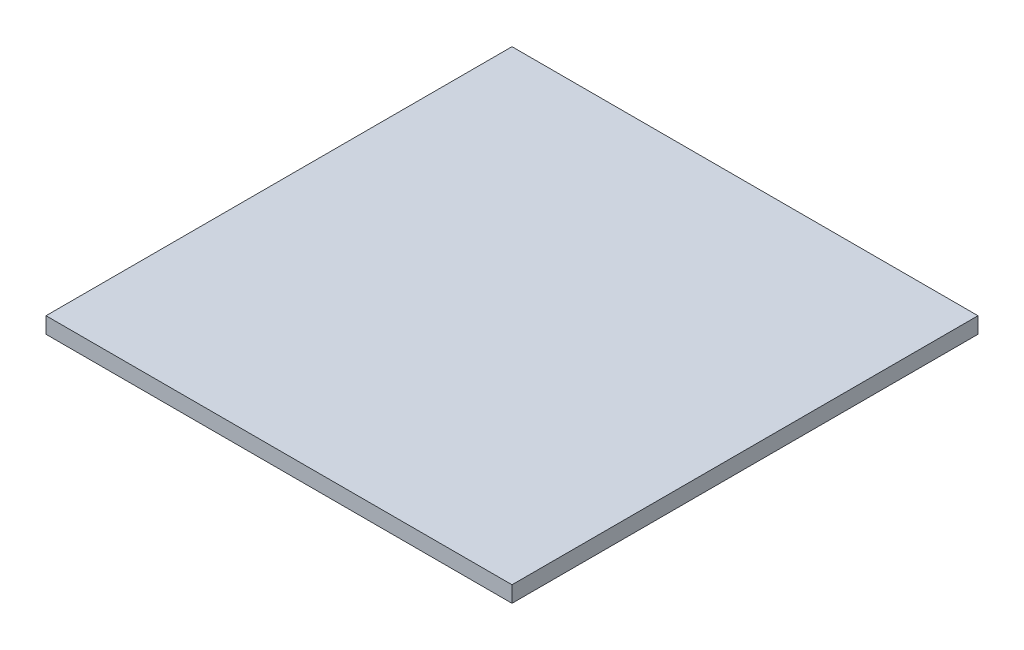
ISO-10303-21;
HEADER;
FILE_DESCRIPTION(('STEP AP214'),'2;1');
FILE_NAME('part.step','',(''),(''),'','','');
FILE_SCHEMA(('AUTOMOTIVE_DESIGN { 1 0 10303 214 1 1 1 1 }'));
ENDSEC;
DATA;
#1=APPLICATION_CONTEXT('core data for automotive mechanical design processes');
#2=APPLICATION_PROTOCOL_DEFINITION('international standard','automotive_design',2000,#1);
#3=PRODUCT_CONTEXT('',#1,'mechanical');
#4=PRODUCT('Part','Part','',(#3));
#5=PRODUCT_RELATED_PRODUCT_CATEGORY('part','',(#4));
#6=PRODUCT_DEFINITION_FORMATION('','',#4);
#7=PRODUCT_DEFINITION_CONTEXT('part definition',#1,'design');
#8=PRODUCT_DEFINITION('design','',#6,#7);
#9=PRODUCT_DEFINITION_SHAPE('','',#8);
#10=(LENGTH_UNIT() NAMED_UNIT(*) SI_UNIT(.MILLI.,.METRE.));
#11=(NAMED_UNIT(*) PLANE_ANGLE_UNIT() SI_UNIT($,.RADIAN.));
#12=(NAMED_UNIT(*) SI_UNIT($,.STERADIAN.) SOLID_ANGLE_UNIT());
#13=UNCERTAINTY_MEASURE_WITH_UNIT(LENGTH_MEASURE(1.E-05),#10,'distance_accuracy_value','');
#14=(GEOMETRIC_REPRESENTATION_CONTEXT(3) GLOBAL_UNCERTAINTY_ASSIGNED_CONTEXT((#13)) GLOBAL_UNIT_ASSIGNED_CONTEXT((#10,
#11,#12)) REPRESENTATION_CONTEXT('',''));
#15=CARTESIAN_POINT('',(0.,0.,0.));
#16=DIRECTION('',(0.,0.,1.));
#17=DIRECTION('',(1.,0.,0.));
#18=AXIS2_PLACEMENT_3D('',#15,#16,#17);
#19=CARTESIAN_POINT('',(-77.216,5.334,-77.216));
#20=DIRECTION('',(1.,0.,0.));
#21=DIRECTION('',(0.,0.,-1.));
#22=AXIS2_PLACEMENT_3D('',#19,#20,#21);
#23=PLANE('',#22);
#24=DIRECTION('',(0.,0.,1.));
#25=VECTOR('',#24,1.);
#26=CARTESIAN_POINT('',(-77.216,0.,-77.216));
#27=LINE('',#26,#25);
#28=CARTESIAN_POINT('',(-77.216,0.,-77.216));
#29=VERTEX_POINT('',#28);
#30=CARTESIAN_POINT('',(-77.216,0.,77.216));
#31=VERTEX_POINT('',#30);
#32=EDGE_CURVE('E95',#29,#31,#27,.T.);
#33=ORIENTED_EDGE('',*,*,#32,.T.);
#34=DIRECTION('',(0.,-1.,0.));
#35=VECTOR('',#34,1.);
#36=CARTESIAN_POINT('',(-77.216,5.334,77.216));
#37=LINE('',#36,#35);
#38=CARTESIAN_POINT('',(-77.216,5.334,77.216));
#39=VERTEX_POINT('',#38);
#40=EDGE_CURVE('E11',#39,#31,#37,.T.);
#41=ORIENTED_EDGE('',*,*,#40,.F.);
#42=DIRECTION('',(0.,0.,1.));
#43=VECTOR('',#42,1.);
#44=CARTESIAN_POINT('',(-77.216,5.334,-77.216));
#45=LINE('',#44,#43);
#46=CARTESIAN_POINT('',(-77.216,5.334,-77.216));
#47=VERTEX_POINT('',#46);
#48=EDGE_CURVE('E83',#47,#39,#45,.T.);
#49=ORIENTED_EDGE('',*,*,#48,.F.);
#50=DIRECTION('',(0.,-1.,0.));
#51=VECTOR('',#50,1.);
#52=CARTESIAN_POINT('',(-77.216,5.334,-77.216));
#53=LINE('',#52,#51);
#54=EDGE_CURVE('E91',#47,#29,#53,.T.);
#55=ORIENTED_EDGE('',*,*,#54,.T.);
#56=EDGE_LOOP('',(#33,#41,#49,#55));
#57=FACE_BOUND('',#56,.T.);
#58=ADVANCED_FACE('F32',(#57),#23,.F.);
#59=CARTESIAN_POINT('',(77.216,5.334,77.216));
#60=DIRECTION('',(0.,0.,-1.));
#61=DIRECTION('',(-1.,0.,0.));
#62=AXIS2_PLACEMENT_3D('',#59,#60,#61);
#63=PLANE('',#62);
#64=DIRECTION('',(1.,0.,0.));
#65=VECTOR('',#64,1.);
#66=CARTESIAN_POINT('',(77.216,0.,77.216));
#67=LINE('',#66,#65);
#68=CARTESIAN_POINT('',(77.216,0.,77.216));
#69=VERTEX_POINT('',#68);
#70=EDGE_CURVE('E87',#31,#69,#67,.T.);
#71=ORIENTED_EDGE('',*,*,#70,.T.);
#72=DIRECTION('',(0.,-1.,0.));
#73=VECTOR('',#72,1.);
#74=CARTESIAN_POINT('',(77.216,5.334,77.216));
#75=LINE('',#74,#73);
#76=CARTESIAN_POINT('',(77.216,5.334,77.216));
#77=VERTEX_POINT('',#76);
#78=EDGE_CURVE('E40',#77,#69,#75,.T.);
#79=ORIENTED_EDGE('',*,*,#78,.F.);
#80=DIRECTION('',(1.,0.,0.));
#81=VECTOR('',#80,1.);
#82=CARTESIAN_POINT('',(77.216,5.334,77.216));
#83=LINE('',#82,#81);
#84=EDGE_CURVE('E78',#39,#77,#83,.T.);
#85=ORIENTED_EDGE('',*,*,#84,.F.);
#86=ORIENTED_EDGE('',*,*,#40,.T.);
#87=EDGE_LOOP('',(#71,#79,#85,#86));
#88=FACE_BOUND('',#87,.T.);
#89=ADVANCED_FACE('F86',(#88),#63,.F.);
#90=CARTESIAN_POINT('',(77.216,5.334,-77.216));
#91=DIRECTION('',(-1.,0.,0.));
#92=DIRECTION('',(0.,0.,1.));
#93=AXIS2_PLACEMENT_3D('',#90,#91,#92);
#94=PLANE('',#93);
#95=DIRECTION('',(0.,0.,-1.));
#96=VECTOR('',#95,1.);
#97=CARTESIAN_POINT('',(77.216,0.,-77.216));
#98=LINE('',#97,#96);
#99=CARTESIAN_POINT('',(77.216,0.,-77.216));
#100=VERTEX_POINT('',#99);
#101=EDGE_CURVE('E65',#69,#100,#98,.T.);
#102=ORIENTED_EDGE('',*,*,#101,.T.);
#103=DIRECTION('',(0.,-1.,0.));
#104=VECTOR('',#103,1.);
#105=CARTESIAN_POINT('',(77.216,5.334,-77.216));
#106=LINE('',#105,#104);
#107=CARTESIAN_POINT('',(77.216,5.334,-77.216));
#108=VERTEX_POINT('',#107);
#109=EDGE_CURVE('E88',#108,#100,#106,.T.);
#110=ORIENTED_EDGE('',*,*,#109,.F.);
#111=DIRECTION('',(0.,0.,-1.));
#112=VECTOR('',#111,1.);
#113=CARTESIAN_POINT('',(77.216,5.334,-77.216));
#114=LINE('',#113,#112);
#115=EDGE_CURVE('E81',#77,#108,#114,.T.);
#116=ORIENTED_EDGE('',*,*,#115,.F.);
#117=ORIENTED_EDGE('',*,*,#78,.T.);
#118=EDGE_LOOP('',(#102,#110,#116,#117));
#119=FACE_BOUND('',#118,.T.);
#120=ADVANCED_FACE('F89',(#119),#94,.F.);
#121=CARTESIAN_POINT('',(77.216,5.334,-77.216));
#122=DIRECTION('',(0.,0.,1.));
#123=DIRECTION('',(1.,0.,0.));
#124=AXIS2_PLACEMENT_3D('',#121,#122,#123);
#125=PLANE('',#124);
#126=DIRECTION('',(-1.,0.,0.));
#127=VECTOR('',#126,1.);
#128=CARTESIAN_POINT('',(77.216,0.,-77.216));
#129=LINE('',#128,#127);
#130=EDGE_CURVE('E71',#100,#29,#129,.T.);
#131=ORIENTED_EDGE('',*,*,#130,.T.);
#132=ORIENTED_EDGE('',*,*,#54,.F.);
#133=DIRECTION('',(-1.,0.,0.));
#134=VECTOR('',#133,1.);
#135=CARTESIAN_POINT('',(77.216,5.334,-77.216));
#136=LINE('',#135,#134);
#137=EDGE_CURVE('E48',#108,#47,#136,.T.);
#138=ORIENTED_EDGE('',*,*,#137,.F.);
#139=ORIENTED_EDGE('',*,*,#109,.T.);
#140=EDGE_LOOP('',(#131,#132,#138,#139));
#141=FACE_BOUND('',#140,.T.);
#142=ADVANCED_FACE('F102',(#141),#125,.F.);
#143=CARTESIAN_POINT('',(-77.216,5.334,77.216));
#144=DIRECTION('',(0.,-1.,0.));
#145=DIRECTION('',(0.,0.,-1.));
#146=AXIS2_PLACEMENT_3D('',#143,#144,#145);
#147=PLANE('',#146);
#148=ORIENTED_EDGE('',*,*,#48,.T.);
#149=ORIENTED_EDGE('',*,*,#84,.T.);
#150=ORIENTED_EDGE('',*,*,#115,.T.);
#151=ORIENTED_EDGE('',*,*,#137,.T.);
#152=EDGE_LOOP('',(#148,#149,#150,#151));
#153=FACE_BOUND('',#152,.T.);
#154=ADVANCED_FACE('F79',(#153),#147,.F.);
#155=CARTESIAN_POINT('',(-77.216,0.,77.216));
#156=DIRECTION('',(0.,-1.,0.));
#157=DIRECTION('',(0.,0.,-1.));
#158=AXIS2_PLACEMENT_3D('',#155,#156,#157);
#159=PLANE('',#158);
#160=ORIENTED_EDGE('',*,*,#32,.F.);
#161=ORIENTED_EDGE('',*,*,#130,.F.);
#162=ORIENTED_EDGE('',*,*,#101,.F.);
#163=ORIENTED_EDGE('',*,*,#70,.F.);
#164=EDGE_LOOP('',(#160,#161,#162,#163));
#165=FACE_BOUND('',#164,.T.);
#166=ADVANCED_FACE('F105',(#165),#159,.T.);
#167=CLOSED_SHELL('',(#58,#89,#120,#142,#154,#166));
#168=MANIFOLD_SOLID_BREP('B2',#167);
#169=ADVANCED_BREP_SHAPE_REPRESENTATION('',(#18,#168),#14);
#170=SHAPE_DEFINITION_REPRESENTATION(#9,#169);
ENDSEC;
END-ISO-10303-21;
